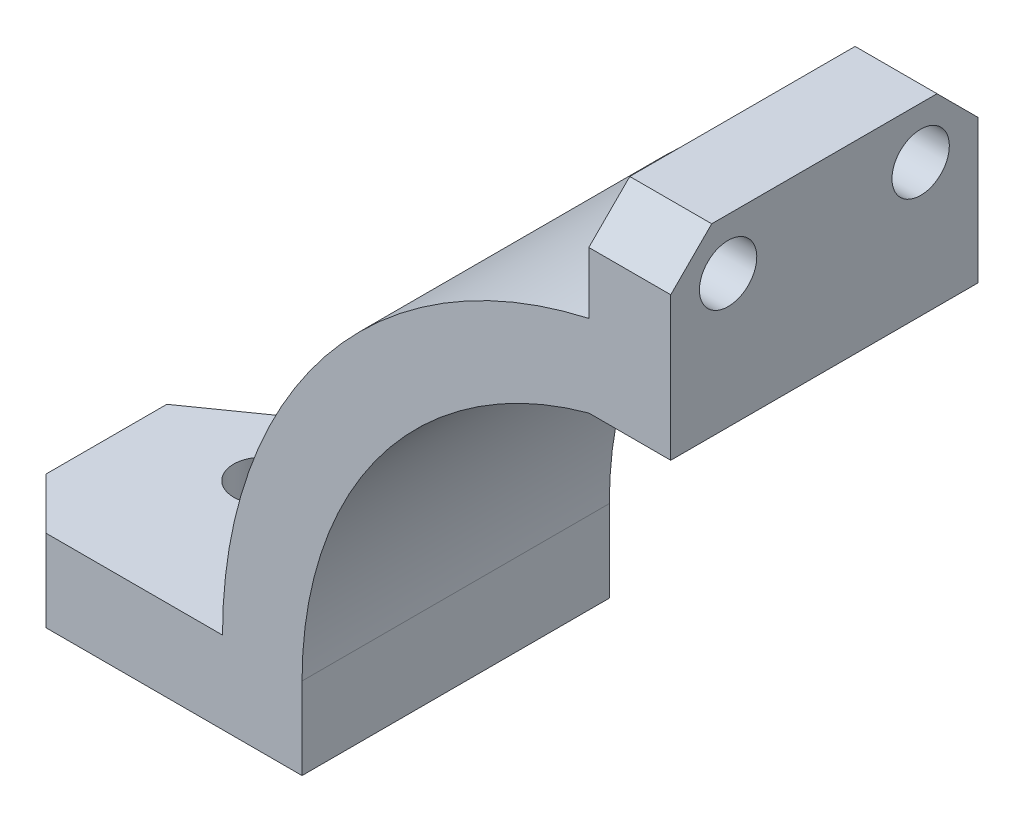
ISO-10303-21;
HEADER;
FILE_DESCRIPTION(('STEP AP214'),'2;1');
FILE_NAME('part.step','',(''),(''),'','','');
FILE_SCHEMA(('AUTOMOTIVE_DESIGN { 1 0 10303 214 1 1 1 1 }'));
ENDSEC;
DATA;
#1=APPLICATION_CONTEXT('core data for automotive mechanical design processes');
#2=APPLICATION_PROTOCOL_DEFINITION('international standard','automotive_design',2000,#1);
#3=PRODUCT_CONTEXT('',#1,'mechanical');
#4=PRODUCT('Part','Part','',(#3));
#5=PRODUCT_RELATED_PRODUCT_CATEGORY('part','',(#4));
#6=PRODUCT_DEFINITION_FORMATION('','',#4);
#7=PRODUCT_DEFINITION_CONTEXT('part definition',#1,'design');
#8=PRODUCT_DEFINITION('design','',#6,#7);
#9=PRODUCT_DEFINITION_SHAPE('','',#8);
#10=(LENGTH_UNIT() NAMED_UNIT(*) SI_UNIT(.MILLI.,.METRE.));
#11=(NAMED_UNIT(*) PLANE_ANGLE_UNIT() SI_UNIT($,.RADIAN.));
#12=(NAMED_UNIT(*) SI_UNIT($,.STERADIAN.) SOLID_ANGLE_UNIT());
#13=UNCERTAINTY_MEASURE_WITH_UNIT(LENGTH_MEASURE(1.E-05),#10,'distance_accuracy_value','');
#14=(GEOMETRIC_REPRESENTATION_CONTEXT(3) GLOBAL_UNCERTAINTY_ASSIGNED_CONTEXT((#13)) GLOBAL_UNIT_ASSIGNED_CONTEXT((#10,
#11,#12)) REPRESENTATION_CONTEXT('',''));
#15=CARTESIAN_POINT('',(0.,0.,0.));
#16=DIRECTION('',(0.,0.,1.));
#17=DIRECTION('',(1.,0.,0.));
#18=AXIS2_PLACEMENT_3D('',#15,#16,#17);
#19=CARTESIAN_POINT('',(0.,0.,15.));
#20=DIRECTION('',(0.,0.,-1.));
#21=DIRECTION('',(-1.,0.,0.));
#22=AXIS2_PLACEMENT_3D('',#19,#20,#21);
#23=CYLINDRICAL_SURFACE('',#22,19.);
#24=CARTESIAN_POINT('',(0.,0.,0.));
#25=DIRECTION('',(0.,0.,-1.));
#26=DIRECTION('',(-1.,0.,0.));
#27=AXIS2_PLACEMENT_3D('',#24,#25,#26);
#28=CIRCLE('',#27,19.);
#29=CARTESIAN_POINT('',(-19.,0.,0.));
#30=VERTEX_POINT('',#29);
#31=CARTESIAN_POINT('',(-5.,18.3303027798234,0.));
#32=VERTEX_POINT('',#31);
#33=EDGE_CURVE('E263',#30,#32,#28,.T.);
#34=ORIENTED_EDGE('',*,*,#33,.T.);
#35=DIRECTION('',(0.,0.,-1.));
#36=VECTOR('',#35,1.);
#37=CARTESIAN_POINT('',(-5.,18.3303027798234,15.));
#38=LINE('',#37,#36);
#39=CARTESIAN_POINT('',(-5.,18.3303027798234,15.));
#40=VERTEX_POINT('',#39);
#41=EDGE_CURVE('E202',#40,#32,#38,.T.);
#42=ORIENTED_EDGE('',*,*,#41,.F.);
#43=CARTESIAN_POINT('',(0.,0.,15.));
#44=DIRECTION('',(0.,0.,-1.));
#45=DIRECTION('',(-1.,0.,0.));
#46=AXIS2_PLACEMENT_3D('',#43,#44,#45);
#47=CIRCLE('',#46,19.);
#48=CARTESIAN_POINT('',(-19.,0.,15.));
#49=VERTEX_POINT('',#48);
#50=EDGE_CURVE('E171',#49,#40,#47,.T.);
#51=ORIENTED_EDGE('',*,*,#50,.F.);
#52=DIRECTION('',(0.,0.,-1.));
#53=VECTOR('',#52,1.);
#54=CARTESIAN_POINT('',(-19.,0.,15.));
#55=LINE('',#54,#53);
#56=EDGE_CURVE('E177',#49,#30,#55,.T.);
#57=ORIENTED_EDGE('',*,*,#56,.T.);
#58=EDGE_LOOP('',(#34,#42,#51,#57));
#59=FACE_BOUND('',#58,.T.);
#60=ADVANCED_FACE('F47',(#59),#23,.F.);
#61=CARTESIAN_POINT('',(-0.999999999999999,18.3303027798234,15.));
#62=DIRECTION('',(0.,1.,0.));
#63=DIRECTION('',(0.,0.,1.));
#64=AXIS2_PLACEMENT_3D('',#61,#62,#63);
#65=PLANE('',#64);
#66=DIRECTION('',(1.,0.,0.));
#67=VECTOR('',#66,1.);
#68=CARTESIAN_POINT('',(-0.999999999999999,18.3303027798234,0.));
#69=LINE('',#68,#67);
#70=CARTESIAN_POINT('',(-0.999999999999999,18.3303027798234,0.));
#71=VERTEX_POINT('',#70);
#72=EDGE_CURVE('E259',#32,#71,#69,.T.);
#73=ORIENTED_EDGE('',*,*,#72,.T.);
#74=DIRECTION('',(0.,0.,-1.));
#75=VECTOR('',#74,1.);
#76=CARTESIAN_POINT('',(-0.999999999999999,18.3303027798234,15.));
#77=LINE('',#76,#75);
#78=CARTESIAN_POINT('',(-0.999999999999999,18.3303027798234,15.));
#79=VERTEX_POINT('',#78);
#80=EDGE_CURVE('E199',#79,#71,#77,.T.);
#81=ORIENTED_EDGE('',*,*,#80,.F.);
#82=DIRECTION('',(1.,0.,0.));
#83=VECTOR('',#82,1.);
#84=CARTESIAN_POINT('',(-0.999999999999999,18.3303027798234,15.));
#85=LINE('',#84,#83);
#86=EDGE_CURVE('E241',#40,#79,#85,.T.);
#87=ORIENTED_EDGE('',*,*,#86,.F.);
#88=ORIENTED_EDGE('',*,*,#41,.T.);
#89=EDGE_LOOP('',(#73,#81,#87,#88));
#90=FACE_BOUND('',#89,.T.);
#91=ADVANCED_FACE('F320',(#90),#65,.F.);
#92=CARTESIAN_POINT('',(-1.,27.3303027798234,15.));
#93=DIRECTION('',(-1.,0.,0.));
#94=DIRECTION('',(0.,-1.,0.));
#95=AXIS2_PLACEMENT_3D('',#92,#93,#94);
#96=PLANE('',#95);
#97=CARTESIAN_POINT('',(-0.999999999999999,24.8303027798234,2.8));
#98=DIRECTION('',(-1.,0.,0.));
#99=DIRECTION('',(0.,-1.,0.));
#100=AXIS2_PLACEMENT_3D('',#97,#98,#99);
#101=CIRCLE('',#100,1.4);
#102=CARTESIAN_POINT('',(-0.999999999999999,23.4303027798234,2.8));
#103=VERTEX_POINT('',#102);
#104=EDGE_CURVE('E266',#103,#103,#101,.T.);
#105=ORIENTED_EDGE('',*,*,#104,.T.);
#106=EDGE_LOOP('',(#105));
#107=FACE_BOUND('',#106,.T.);
#108=CARTESIAN_POINT('',(-0.999999999999999,24.8303027798234,12.2));
#109=DIRECTION('',(-1.,0.,0.));
#110=DIRECTION('',(0.,-1.,0.));
#111=AXIS2_PLACEMENT_3D('',#108,#109,#110);
#112=CIRCLE('',#111,1.4);
#113=CARTESIAN_POINT('',(-0.999999999999999,23.4303027798234,12.2));
#114=VERTEX_POINT('',#113);
#115=EDGE_CURVE('E280',#114,#114,#112,.T.);
#116=ORIENTED_EDGE('',*,*,#115,.T.);
#117=EDGE_LOOP('',(#116));
#118=FACE_BOUND('',#117,.T.);
#119=DIRECTION('',(0.,0.,-1.));
#120=VECTOR('',#119,1.);
#121=CARTESIAN_POINT('',(-1.,27.3303027798234,15.));
#122=LINE('',#121,#120);
#123=CARTESIAN_POINT('',(-1.,27.3303027798234,13.));
#124=VERTEX_POINT('',#123);
#125=CARTESIAN_POINT('',(-1.,27.3303027798234,2.));
#126=VERTEX_POINT('',#125);
#127=EDGE_CURVE('E196',#124,#126,#122,.T.);
#128=ORIENTED_EDGE('',*,*,#127,.F.);
#129=DIRECTION('',(0.,0.707106781186546,-0.707106781186549));
#130=VECTOR('',#129,1.);
#131=CARTESIAN_POINT('',(-1.,25.3303027798234,15.));
#132=LINE('',#131,#130);
#133=CARTESIAN_POINT('',(-1.,25.3303027798234,15.));
#134=VERTEX_POINT('',#133);
#135=EDGE_CURVE('E56',#124,#134,#132,.F.);
#136=ORIENTED_EDGE('',*,*,#135,.T.);
#137=DIRECTION('',(0.,1.,0.));
#138=VECTOR('',#137,1.);
#139=CARTESIAN_POINT('',(-1.,27.3303027798234,15.));
#140=LINE('',#139,#138);
#141=EDGE_CURVE('E233',#79,#134,#140,.T.);
#142=ORIENTED_EDGE('',*,*,#141,.F.);
#143=ORIENTED_EDGE('',*,*,#80,.T.);
#144=DIRECTION('',(0.,1.,0.));
#145=VECTOR('',#144,1.);
#146=CARTESIAN_POINT('',(-1.,27.3303027798234,0.));
#147=LINE('',#146,#145);
#148=CARTESIAN_POINT('',(-1.,25.3303027798234,0.));
#149=VERTEX_POINT('',#148);
#150=EDGE_CURVE('E257',#71,#149,#147,.T.);
#151=ORIENTED_EDGE('',*,*,#150,.T.);
#152=DIRECTION('',(0.,0.707106781186549,0.707106781186546));
#153=VECTOR('',#152,1.);
#154=CARTESIAN_POINT('',(-1.,27.3303027798234,2.));
#155=LINE('',#154,#153);
#156=EDGE_CURVE('E226',#149,#126,#155,.T.);
#157=ORIENTED_EDGE('',*,*,#156,.T.);
#158=EDGE_LOOP('',(#128,#136,#142,#143,#151,#157));
#159=FACE_BOUND('',#158,.T.);
#160=ADVANCED_FACE('F232',(#107,#118,#159),#96,.F.);
#161=CARTESIAN_POINT('',(-5.,27.3303027798234,15.));
#162=DIRECTION('',(0.,-1.,0.));
#163=DIRECTION('',(0.,0.,-1.));
#164=AXIS2_PLACEMENT_3D('',#161,#162,#163);
#165=PLANE('',#164);
#166=DIRECTION('',(0.,0.,-1.));
#167=VECTOR('',#166,1.);
#168=CARTESIAN_POINT('',(-5.,27.3303027798234,15.));
#169=LINE('',#168,#167);
#170=CARTESIAN_POINT('',(-5.,27.3303027798234,13.));
#171=VERTEX_POINT('',#170);
#172=CARTESIAN_POINT('',(-5.,27.3303027798234,2.));
#173=VERTEX_POINT('',#172);
#174=EDGE_CURVE('E193',#171,#173,#169,.T.);
#175=ORIENTED_EDGE('',*,*,#174,.F.);
#176=DIRECTION('',(1.,0.,0.));
#177=VECTOR('',#176,1.);
#178=CARTESIAN_POINT('',(-5.,27.3303027798234,13.));
#179=LINE('',#178,#177);
#180=EDGE_CURVE('E224',#171,#124,#179,.T.);
#181=ORIENTED_EDGE('',*,*,#180,.T.);
#182=ORIENTED_EDGE('',*,*,#127,.T.);
#183=DIRECTION('',(-1.,0.,0.));
#184=VECTOR('',#183,1.);
#185=CARTESIAN_POINT('',(-5.,27.3303027798234,2.));
#186=LINE('',#185,#184);
#187=EDGE_CURVE('E221',#126,#173,#186,.T.);
#188=ORIENTED_EDGE('',*,*,#187,.T.);
#189=EDGE_LOOP('',(#175,#181,#182,#188));
#190=FACE_BOUND('',#189,.T.);
#191=ADVANCED_FACE('F251',(#190),#165,.F.);
#192=CARTESIAN_POINT('',(-5.,22.3303027798234,15.));
#193=DIRECTION('',(1.,0.,0.));
#194=DIRECTION('',(0.,1.,0.));
#195=AXIS2_PLACEMENT_3D('',#192,#193,#194);
#196=PLANE('',#195);
#197=CARTESIAN_POINT('',(-5.,24.8303027798234,2.8));
#198=DIRECTION('',(-1.,0.,0.));
#199=DIRECTION('',(0.,-1.,0.));
#200=AXIS2_PLACEMENT_3D('',#197,#198,#199);
#201=CIRCLE('',#200,1.4);
#202=CARTESIAN_POINT('',(-5.,23.4303027798234,2.8));
#203=VERTEX_POINT('',#202);
#204=EDGE_CURVE('E283',#203,#203,#201,.T.);
#205=ORIENTED_EDGE('',*,*,#204,.F.);
#206=EDGE_LOOP('',(#205));
#207=FACE_BOUND('',#206,.T.);
#208=CARTESIAN_POINT('',(-5.,24.8303027798234,12.2));
#209=DIRECTION('',(-1.,0.,0.));
#210=DIRECTION('',(0.,-1.,0.));
#211=AXIS2_PLACEMENT_3D('',#208,#209,#210);
#212=CIRCLE('',#211,1.4);
#213=CARTESIAN_POINT('',(-5.,23.4303027798234,12.2));
#214=VERTEX_POINT('',#213);
#215=EDGE_CURVE('E284',#214,#214,#212,.T.);
#216=ORIENTED_EDGE('',*,*,#215,.F.);
#217=EDGE_LOOP('',(#216));
#218=FACE_BOUND('',#217,.T.);
#219=DIRECTION('',(0.,-1.,0.));
#220=VECTOR('',#219,1.);
#221=CARTESIAN_POINT('',(-5.,22.3303027798234,15.));
#222=LINE('',#221,#220);
#223=CARTESIAN_POINT('',(-5.,25.3303027798234,15.));
#224=VERTEX_POINT('',#223);
#225=CARTESIAN_POINT('',(-5.,22.3303027798234,15.));
#226=VERTEX_POINT('',#225);
#227=EDGE_CURVE('E243',#224,#226,#222,.T.);
#228=ORIENTED_EDGE('',*,*,#227,.F.);
#229=DIRECTION('',(0.,-0.707106781186546,0.707106781186549));
#230=VECTOR('',#229,1.);
#231=CARTESIAN_POINT('',(-5.,25.3303027798234,15.));
#232=LINE('',#231,#230);
#233=EDGE_CURVE('E219',#224,#171,#232,.F.);
#234=ORIENTED_EDGE('',*,*,#233,.T.);
#235=ORIENTED_EDGE('',*,*,#174,.T.);
#236=DIRECTION('',(0.,-0.707106781186549,-0.707106781186546));
#237=VECTOR('',#236,1.);
#238=CARTESIAN_POINT('',(-5.,27.3303027798234,2.));
#239=LINE('',#238,#237);
#240=CARTESIAN_POINT('',(-5.,25.3303027798234,0.));
#241=VERTEX_POINT('',#240);
#242=EDGE_CURVE('E217',#173,#241,#239,.T.);
#243=ORIENTED_EDGE('',*,*,#242,.T.);
#244=DIRECTION('',(0.,-1.,0.));
#245=VECTOR('',#244,1.);
#246=CARTESIAN_POINT('',(-5.,22.3303027798234,0.));
#247=LINE('',#246,#245);
#248=CARTESIAN_POINT('',(-5.,22.3303027798234,0.));
#249=VERTEX_POINT('',#248);
#250=EDGE_CURVE('E255',#241,#249,#247,.T.);
#251=ORIENTED_EDGE('',*,*,#250,.T.);
#252=DIRECTION('',(0.,0.,-1.));
#253=VECTOR('',#252,1.);
#254=CARTESIAN_POINT('',(-5.,22.3303027798234,15.));
#255=LINE('',#254,#253);
#256=EDGE_CURVE('E190',#226,#249,#255,.T.);
#257=ORIENTED_EDGE('',*,*,#256,.F.);
#258=EDGE_LOOP('',(#228,#234,#235,#243,#251,#257));
#259=FACE_BOUND('',#258,.T.);
#260=ADVANCED_FACE('F248',(#207,#218,#259),#196,.F.);
#261=CARTESIAN_POINT('',(0.,0.,15.));
#262=DIRECTION('',(0.,0.,-1.));
#263=DIRECTION('',(-1.,0.,0.));
#264=AXIS2_PLACEMENT_3D('',#261,#262,#263);
#265=CYLINDRICAL_SURFACE('',#264,22.8832345230867);
#266=CARTESIAN_POINT('',(0.,0.,0.));
#267=DIRECTION('',(0.,0.,1.));
#268=DIRECTION('',(-1.,0.,0.));
#269=AXIS2_PLACEMENT_3D('',#266,#267,#268);
#270=CIRCLE('',#269,22.8832345230867);
#271=CARTESIAN_POINT('',(-22.8832345230867,0.,0.));
#272=VERTEX_POINT('',#271);
#273=EDGE_CURVE('E173',#249,#272,#270,.T.);
#274=ORIENTED_EDGE('',*,*,#273,.T.);
#275=DIRECTION('',(0.,0.,-1.));
#276=VECTOR('',#275,1.);
#277=CARTESIAN_POINT('',(-22.8832345230867,0.,15.));
#278=LINE('',#277,#276);
#279=CARTESIAN_POINT('',(-22.8832345230867,0.,15.));
#280=VERTEX_POINT('',#279);
#281=EDGE_CURVE('E187',#280,#272,#278,.T.);
#282=ORIENTED_EDGE('',*,*,#281,.F.);
#283=CARTESIAN_POINT('',(0.,0.,15.));
#284=DIRECTION('',(0.,0.,1.));
#285=DIRECTION('',(-1.,0.,0.));
#286=AXIS2_PLACEMENT_3D('',#283,#284,#285);
#287=CIRCLE('',#286,22.8832345230867);
#288=EDGE_CURVE('E273',#226,#280,#287,.T.);
#289=ORIENTED_EDGE('',*,*,#288,.F.);
#290=ORIENTED_EDGE('',*,*,#256,.T.);
#291=EDGE_LOOP('',(#274,#282,#289,#290));
#292=FACE_BOUND('',#291,.T.);
#293=ADVANCED_FACE('F307',(#292),#265,.T.);
#294=CARTESIAN_POINT('',(-34.,0.,15.));
#295=DIRECTION('',(0.,-1.,0.));
#296=DIRECTION('',(0.,0.,-1.));
#297=AXIS2_PLACEMENT_3D('',#294,#295,#296);
#298=PLANE('',#297);
#299=CARTESIAN_POINT('',(-28.4416172615434,0.,7.5));
#300=DIRECTION('',(0.,1.,0.));
#301=DIRECTION('',(0.,0.,1.));
#302=AXIS2_PLACEMENT_3D('',#299,#300,#301);
#303=CIRCLE('',#302,1.4);
#304=CARTESIAN_POINT('',(-28.4416172615434,0.,8.9));
#305=VERTEX_POINT('',#304);
#306=EDGE_CURVE('E290',#305,#305,#303,.T.);
#307=ORIENTED_EDGE('',*,*,#306,.F.);
#308=EDGE_LOOP('',(#307));
#309=FACE_BOUND('',#308,.T.);
#310=DIRECTION('',(-1.,0.,0.));
#311=VECTOR('',#310,1.);
#312=CARTESIAN_POINT('',(-34.,0.,0.));
#313=LINE('',#312,#311);
#314=CARTESIAN_POINT('',(-24.6360697013909,0.,0.));
#315=VERTEX_POINT('',#314);
#316=EDGE_CURVE('E169',#272,#315,#313,.T.);
#317=ORIENTED_EDGE('',*,*,#316,.T.);
#318=DIRECTION('',(-0.817355943758289,0.,0.576133023878164));
#319=VECTOR('',#318,1.);
#320=CARTESIAN_POINT('',(-37.9554238059601,0.,9.38846755195163));
#321=LINE('',#320,#319);
#322=CARTESIAN_POINT('',(-34.,0.,6.60039181157212));
#323=VERTEX_POINT('',#322);
#324=EDGE_CURVE('E63',#315,#323,#321,.T.);
#325=ORIENTED_EDGE('',*,*,#324,.T.);
#326=DIRECTION('',(0.,0.,-1.));
#327=VECTOR('',#326,1.);
#328=CARTESIAN_POINT('',(-34.,0.,15.));
#329=LINE('',#328,#327);
#330=CARTESIAN_POINT('',(-34.,0.,12.5));
#331=VERTEX_POINT('',#330);
#332=EDGE_CURVE('E184',#331,#323,#329,.T.);
#333=ORIENTED_EDGE('',*,*,#332,.F.);
#334=DIRECTION('',(-0.707106781186549,0.,-0.707106781186547));
#335=VECTOR('',#334,1.);
#336=CARTESIAN_POINT('',(-31.5,0.,15.));
#337=LINE('',#336,#335);
#338=CARTESIAN_POINT('',(-31.5,0.,15.));
#339=VERTEX_POINT('',#338);
#340=EDGE_CURVE('E209',#331,#339,#337,.F.);
#341=ORIENTED_EDGE('',*,*,#340,.T.);
#342=DIRECTION('',(-1.,0.,0.));
#343=VECTOR('',#342,1.);
#344=CARTESIAN_POINT('',(-34.,0.,15.));
#345=LINE('',#344,#343);
#346=EDGE_CURVE('E270',#280,#339,#345,.T.);
#347=ORIENTED_EDGE('',*,*,#346,.F.);
#348=ORIENTED_EDGE('',*,*,#281,.T.);
#349=EDGE_LOOP('',(#317,#325,#333,#341,#347,#348));
#350=FACE_BOUND('',#349,.T.);
#351=ADVANCED_FACE('F301',(#309,#350),#298,.F.);
#352=CARTESIAN_POINT('',(-34.,-4.,15.));
#353=DIRECTION('',(1.,0.,0.));
#354=DIRECTION('',(0.,1.,0.));
#355=AXIS2_PLACEMENT_3D('',#352,#353,#354);
#356=PLANE('',#355);
#357=ORIENTED_EDGE('',*,*,#332,.T.);
#358=DIRECTION('',(0.,-1.,0.));
#359=VECTOR('',#358,1.);
#360=CARTESIAN_POINT('',(-34.,21.,6.60039181157212));
#361=LINE('',#360,#359);
#362=CARTESIAN_POINT('',(-34.,-4.,6.60039181157212));
#363=VERTEX_POINT('',#362);
#364=EDGE_CURVE('E154',#323,#363,#361,.T.);
#365=ORIENTED_EDGE('',*,*,#364,.T.);
#366=DIRECTION('',(0.,0.,-1.));
#367=VECTOR('',#366,1.);
#368=CARTESIAN_POINT('',(-34.,-4.,15.));
#369=LINE('',#368,#367);
#370=CARTESIAN_POINT('',(-34.,-4.,12.5));
#371=VERTEX_POINT('',#370);
#372=EDGE_CURVE('E163',#371,#363,#369,.T.);
#373=ORIENTED_EDGE('',*,*,#372,.F.);
#374=DIRECTION('',(0.,1.,0.));
#375=VECTOR('',#374,1.);
#376=CARTESIAN_POINT('',(-34.,-4.,12.5));
#377=LINE('',#376,#375);
#378=EDGE_CURVE('E205',#371,#331,#377,.T.);
#379=ORIENTED_EDGE('',*,*,#378,.T.);
#380=EDGE_LOOP('',(#357,#365,#373,#379));
#381=FACE_BOUND('',#380,.T.);
#382=ADVANCED_FACE('F297',(#381),#356,.F.);
#383=CARTESIAN_POINT('',(-19.,-4.,15.));
#384=DIRECTION('',(0.,1.,0.));
#385=DIRECTION('',(-1.,0.,0.));
#386=AXIS2_PLACEMENT_3D('',#383,#384,#385);
#387=PLANE('',#386);
#388=CARTESIAN_POINT('',(-28.4416172615434,-4.,7.5));
#389=DIRECTION('',(0.,1.,0.));
#390=DIRECTION('',(0.,0.,1.));
#391=AXIS2_PLACEMENT_3D('',#388,#389,#390);
#392=CIRCLE('',#391,1.4);
#393=CARTESIAN_POINT('',(-28.4416172615434,-4.,8.9));
#394=VERTEX_POINT('',#393);
#395=EDGE_CURVE('E287',#394,#394,#392,.T.);
#396=ORIENTED_EDGE('',*,*,#395,.T.);
#397=EDGE_LOOP('',(#396));
#398=FACE_BOUND('',#397,.T.);
#399=ORIENTED_EDGE('',*,*,#372,.T.);
#400=DIRECTION('',(-0.817355943758289,0.,0.576133023878164));
#401=VECTOR('',#400,1.);
#402=CARTESIAN_POINT('',(-24.6360697013909,-4.,0.));
#403=LINE('',#402,#401);
#404=CARTESIAN_POINT('',(-24.6360697013909,-4.,0.));
#405=VERTEX_POINT('',#404);
#406=EDGE_CURVE('E149',#405,#363,#403,.T.);
#407=ORIENTED_EDGE('',*,*,#406,.F.);
#408=DIRECTION('',(1.,0.,0.));
#409=VECTOR('',#408,1.);
#410=CARTESIAN_POINT('',(-19.,-4.,0.));
#411=LINE('',#410,#409);
#412=CARTESIAN_POINT('',(-19.,-4.,0.));
#413=VERTEX_POINT('',#412);
#414=EDGE_CURVE('E160',#405,#413,#411,.T.);
#415=ORIENTED_EDGE('',*,*,#414,.T.);
#416=DIRECTION('',(0.,0.,-1.));
#417=VECTOR('',#416,1.);
#418=CARTESIAN_POINT('',(-19.,-4.,15.));
#419=LINE('',#418,#417);
#420=CARTESIAN_POINT('',(-19.,-4.,15.));
#421=VERTEX_POINT('',#420);
#422=EDGE_CURVE('E180',#421,#413,#419,.T.);
#423=ORIENTED_EDGE('',*,*,#422,.F.);
#424=DIRECTION('',(1.,0.,0.));
#425=VECTOR('',#424,1.);
#426=CARTESIAN_POINT('',(-19.,-4.,15.));
#427=LINE('',#426,#425);
#428=CARTESIAN_POINT('',(-31.5,-4.,15.));
#429=VERTEX_POINT('',#428);
#430=EDGE_CURVE('E268',#429,#421,#427,.T.);
#431=ORIENTED_EDGE('',*,*,#430,.F.);
#432=DIRECTION('',(0.707106781186549,0.,0.707106781186547));
#433=VECTOR('',#432,1.);
#434=CARTESIAN_POINT('',(-31.5,-4.,15.));
#435=LINE('',#434,#433);
#436=EDGE_CURVE('E207',#429,#371,#435,.F.);
#437=ORIENTED_EDGE('',*,*,#436,.T.);
#438=EDGE_LOOP('',(#399,#407,#415,#423,#431,#437));
#439=FACE_BOUND('',#438,.T.);
#440=ADVANCED_FACE('F158',(#398,#439),#387,.F.);
#441=CARTESIAN_POINT('',(-19.,0.,15.));
#442=DIRECTION('',(-1.,0.,0.));
#443=DIRECTION('',(0.,-1.,0.));
#444=AXIS2_PLACEMENT_3D('',#441,#442,#443);
#445=PLANE('',#444);
#446=DIRECTION('',(0.,1.,0.));
#447=VECTOR('',#446,1.);
#448=CARTESIAN_POINT('',(-19.,0.,0.));
#449=LINE('',#448,#447);
#450=EDGE_CURVE('E168',#413,#30,#449,.T.);
#451=ORIENTED_EDGE('',*,*,#450,.T.);
#452=ORIENTED_EDGE('',*,*,#56,.F.);
#453=DIRECTION('',(0.,1.,0.));
#454=VECTOR('',#453,1.);
#455=CARTESIAN_POINT('',(-19.,0.,15.));
#456=LINE('',#455,#454);
#457=EDGE_CURVE('E181',#421,#49,#456,.T.);
#458=ORIENTED_EDGE('',*,*,#457,.F.);
#459=ORIENTED_EDGE('',*,*,#422,.T.);
#460=EDGE_LOOP('',(#451,#452,#458,#459));
#461=FACE_BOUND('',#460,.T.);
#462=ADVANCED_FACE('F317',(#461),#445,.F.);
#463=CARTESIAN_POINT('',(0.,0.,15.));
#464=DIRECTION('',(0.,0.,-1.));
#465=DIRECTION('',(-1.,0.,0.));
#466=AXIS2_PLACEMENT_3D('',#463,#464,#465);
#467=PLANE('',#466);
#468=ORIENTED_EDGE('',*,*,#141,.T.);
#469=DIRECTION('',(-1.,0.,0.));
#470=VECTOR('',#469,1.);
#471=CARTESIAN_POINT('',(0.,25.3303027798234,15.));
#472=LINE('',#471,#470);
#473=EDGE_CURVE('E214',#134,#224,#472,.T.);
#474=ORIENTED_EDGE('',*,*,#473,.T.);
#475=ORIENTED_EDGE('',*,*,#227,.T.);
#476=ORIENTED_EDGE('',*,*,#288,.T.);
#477=ORIENTED_EDGE('',*,*,#346,.T.);
#478=DIRECTION('',(0.,-1.,0.));
#479=VECTOR('',#478,1.);
#480=CARTESIAN_POINT('',(-31.5,0.,15.));
#481=LINE('',#480,#479);
#482=EDGE_CURVE('E211',#339,#429,#481,.T.);
#483=ORIENTED_EDGE('',*,*,#482,.T.);
#484=ORIENTED_EDGE('',*,*,#430,.T.);
#485=ORIENTED_EDGE('',*,*,#457,.T.);
#486=ORIENTED_EDGE('',*,*,#50,.T.);
#487=ORIENTED_EDGE('',*,*,#86,.T.);
#488=EDGE_LOOP('',(#468,#474,#475,#476,#477,#483,#484,#485,#486,#487));
#489=FACE_BOUND('',#488,.T.);
#490=ADVANCED_FACE('F238',(#489),#467,.F.);
#491=CARTESIAN_POINT('',(0.,0.,0.));
#492=DIRECTION('',(0.,0.,-1.));
#493=DIRECTION('',(-1.,0.,0.));
#494=AXIS2_PLACEMENT_3D('',#491,#492,#493);
#495=PLANE('',#494);
#496=DIRECTION('',(0.,-1.,0.));
#497=VECTOR('',#496,1.);
#498=CARTESIAN_POINT('',(-24.6360697013909,21.,0.));
#499=LINE('',#498,#497);
#500=EDGE_CURVE('E146',#315,#405,#499,.T.);
#501=ORIENTED_EDGE('',*,*,#500,.F.);
#502=ORIENTED_EDGE('',*,*,#316,.F.);
#503=ORIENTED_EDGE('',*,*,#273,.F.);
#504=ORIENTED_EDGE('',*,*,#250,.F.);
#505=DIRECTION('',(1.,0.,0.));
#506=VECTOR('',#505,1.);
#507=CARTESIAN_POINT('',(-1.,25.3303027798234,0.));
#508=LINE('',#507,#506);
#509=EDGE_CURVE('E11',#241,#149,#508,.T.);
#510=ORIENTED_EDGE('',*,*,#509,.T.);
#511=ORIENTED_EDGE('',*,*,#150,.F.);
#512=ORIENTED_EDGE('',*,*,#72,.F.);
#513=ORIENTED_EDGE('',*,*,#33,.F.);
#514=ORIENTED_EDGE('',*,*,#450,.F.);
#515=ORIENTED_EDGE('',*,*,#414,.F.);
#516=EDGE_LOOP('',(#501,#502,#503,#504,#510,#511,#512,#513,#514,#515));
#517=FACE_BOUND('',#516,.T.);
#518=ADVANCED_FACE('F166',(#517),#495,.T.);
#519=CARTESIAN_POINT('',(-31.5,0.,15.));
#520=DIRECTION('',(0.707106781186547,0.,-0.707106781186549));
#521=DIRECTION('',(0.,-1.,0.));
#522=AXIS2_PLACEMENT_3D('',#519,#520,#521);
#523=PLANE('',#522);
#524=ORIENTED_EDGE('',*,*,#340,.F.);
#525=ORIENTED_EDGE('',*,*,#378,.F.);
#526=ORIENTED_EDGE('',*,*,#436,.F.);
#527=ORIENTED_EDGE('',*,*,#482,.F.);
#528=EDGE_LOOP('',(#524,#525,#526,#527));
#529=FACE_BOUND('',#528,.T.);
#530=ADVANCED_FACE('F311',(#529),#523,.F.);
#531=CARTESIAN_POINT('',(10.,24.8303027798234,12.2));
#532=DIRECTION('',(-1.,0.,0.));
#533=DIRECTION('',(0.,-1.,0.));
#534=AXIS2_PLACEMENT_3D('',#531,#532,#533);
#535=CYLINDRICAL_SURFACE('',#534,1.4);
#536=ORIENTED_EDGE('',*,*,#215,.T.);
#537=EDGE_LOOP('',(#536));
#538=FACE_BOUND('',#537,.T.);
#539=ORIENTED_EDGE('',*,*,#115,.F.);
#540=EDGE_LOOP('',(#539));
#541=FACE_BOUND('',#540,.T.);
#542=ADVANCED_FACE('F338',(#538,#541),#535,.F.);
#543=CARTESIAN_POINT('',(10.,24.8303027798234,2.8));
#544=DIRECTION('',(-1.,0.,0.));
#545=DIRECTION('',(0.,-1.,0.));
#546=AXIS2_PLACEMENT_3D('',#543,#544,#545);
#547=CYLINDRICAL_SURFACE('',#546,1.4);
#548=ORIENTED_EDGE('',*,*,#204,.T.);
#549=EDGE_LOOP('',(#548));
#550=FACE_BOUND('',#549,.T.);
#551=ORIENTED_EDGE('',*,*,#104,.F.);
#552=EDGE_LOOP('',(#551));
#553=FACE_BOUND('',#552,.T.);
#554=ADVANCED_FACE('F342',(#550,#553),#547,.F.);
#555=CARTESIAN_POINT('',(0.,25.3303027798234,15.));
#556=DIRECTION('',(0.,-0.707106781186549,-0.707106781186546));
#557=DIRECTION('',(-1.,0.,0.));
#558=AXIS2_PLACEMENT_3D('',#555,#556,#557);
#559=PLANE('',#558);
#560=ORIENTED_EDGE('',*,*,#135,.F.);
#561=ORIENTED_EDGE('',*,*,#180,.F.);
#562=ORIENTED_EDGE('',*,*,#233,.F.);
#563=ORIENTED_EDGE('',*,*,#473,.F.);
#564=EDGE_LOOP('',(#560,#561,#562,#563));
#565=FACE_BOUND('',#564,.T.);
#566=ADVANCED_FACE('F245',(#565),#559,.F.);
#567=CARTESIAN_POINT('',(-5.,27.3303027798234,2.));
#568=DIRECTION('',(0.,0.707106781186546,-0.707106781186549));
#569=DIRECTION('',(1.,0.,0.));
#570=AXIS2_PLACEMENT_3D('',#567,#568,#569);
#571=PLANE('',#570);
#572=ORIENTED_EDGE('',*,*,#156,.F.);
#573=ORIENTED_EDGE('',*,*,#509,.F.);
#574=ORIENTED_EDGE('',*,*,#242,.F.);
#575=ORIENTED_EDGE('',*,*,#187,.F.);
#576=EDGE_LOOP('',(#572,#573,#574,#575));
#577=FACE_BOUND('',#576,.T.);
#578=ADVANCED_FACE('F50',(#577),#571,.T.);
#579=CARTESIAN_POINT('',(-28.4416172615434,-4.,7.5));
#580=DIRECTION('',(0.,1.,0.));
#581=DIRECTION('',(0.,0.,1.));
#582=AXIS2_PLACEMENT_3D('',#579,#580,#581);
#583=CYLINDRICAL_SURFACE('',#582,1.4);
#584=ORIENTED_EDGE('',*,*,#395,.F.);
#585=EDGE_LOOP('',(#584));
#586=FACE_BOUND('',#585,.T.);
#587=ORIENTED_EDGE('',*,*,#306,.T.);
#588=EDGE_LOOP('',(#587));
#589=FACE_BOUND('',#588,.T.);
#590=ADVANCED_FACE('F347',(#586,#589),#583,.F.);
#591=CARTESIAN_POINT('',(-24.6360697013909,21.,0.));
#592=DIRECTION('',(0.576133023878164,0.,0.817355943758289));
#593=DIRECTION('',(0.817355943758289,0.,-0.576133023878164));
#594=AXIS2_PLACEMENT_3D('',#591,#592,#593);
#595=PLANE('',#594);
#596=ORIENTED_EDGE('',*,*,#500,.T.);
#597=ORIENTED_EDGE('',*,*,#406,.T.);
#598=ORIENTED_EDGE('',*,*,#364,.F.);
#599=ORIENTED_EDGE('',*,*,#324,.F.);
#600=EDGE_LOOP('',(#596,#597,#598,#599));
#601=FACE_BOUND('',#600,.T.);
#602=ADVANCED_FACE('F148',(#601),#595,.F.);
#603=CLOSED_SHELL('',(#60,#91,#160,#191,#260,#293,#351,#382,#440,#462,#490,#518,#530,#542,#554,
#566,#578,#590,#602));
#604=MANIFOLD_SOLID_BREP('B2',#603);
#605=ADVANCED_BREP_SHAPE_REPRESENTATION('',(#18,#604),#14);
#606=SHAPE_DEFINITION_REPRESENTATION(#9,#605);
ENDSEC;
END-ISO-10303-21;
